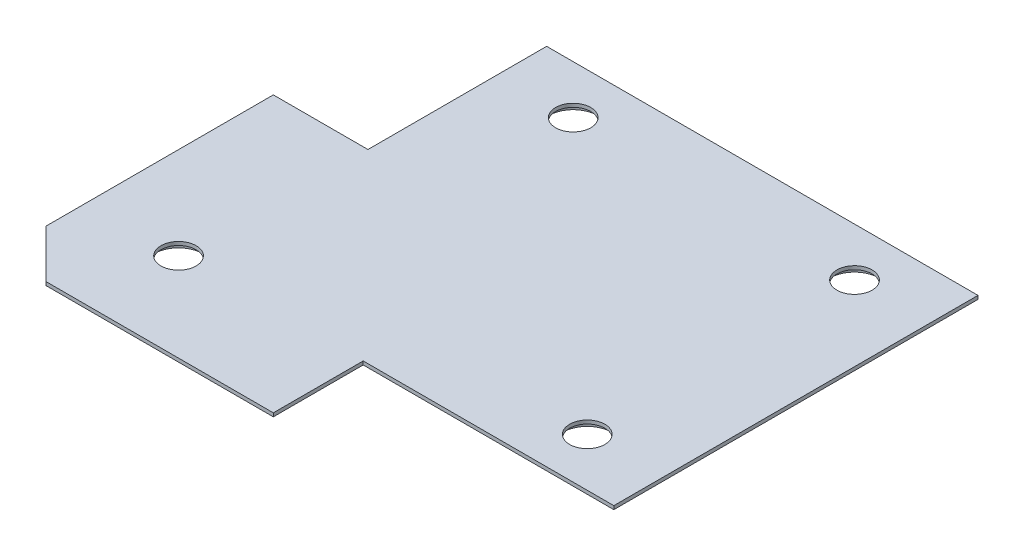
ISO-10303-21;
HEADER;
FILE_DESCRIPTION(('STEP AP214'),'2;1');
FILE_NAME('part.step','',(''),(''),'','','');
FILE_SCHEMA(('AUTOMOTIVE_DESIGN { 1 0 10303 214 1 1 1 1 }'));
ENDSEC;
DATA;
#1=APPLICATION_CONTEXT('core data for automotive mechanical design processes');
#2=APPLICATION_PROTOCOL_DEFINITION('international standard','automotive_design',2000,#1);
#3=PRODUCT_CONTEXT('',#1,'mechanical');
#4=PRODUCT('Part','Part','',(#3));
#5=PRODUCT_RELATED_PRODUCT_CATEGORY('part','',(#4));
#6=PRODUCT_DEFINITION_FORMATION('','',#4);
#7=PRODUCT_DEFINITION_CONTEXT('part definition',#1,'design');
#8=PRODUCT_DEFINITION('design','',#6,#7);
#9=PRODUCT_DEFINITION_SHAPE('','',#8);
#10=(LENGTH_UNIT() NAMED_UNIT(*) SI_UNIT(.MILLI.,.METRE.));
#11=(NAMED_UNIT(*) PLANE_ANGLE_UNIT() SI_UNIT($,.RADIAN.));
#12=(NAMED_UNIT(*) SI_UNIT($,.STERADIAN.) SOLID_ANGLE_UNIT());
#13=UNCERTAINTY_MEASURE_WITH_UNIT(LENGTH_MEASURE(1.E-05),#10,'distance_accuracy_value','');
#14=(GEOMETRIC_REPRESENTATION_CONTEXT(3) GLOBAL_UNCERTAINTY_ASSIGNED_CONTEXT((#13)) GLOBAL_UNIT_ASSIGNED_CONTEXT((#10,
#11,#12)) REPRESENTATION_CONTEXT('',''));
#15=CARTESIAN_POINT('',(0.,0.,0.));
#16=DIRECTION('',(0.,0.,1.));
#17=DIRECTION('',(1.,0.,0.));
#18=AXIS2_PLACEMENT_3D('',#15,#16,#17);
#19=CARTESIAN_POINT('',(21.1851643736294,1.5,-18.54562572709));
#20=DIRECTION('',(0.,1.,0.));
#21=DIRECTION('',(0.,0.,1.));
#22=AXIS2_PLACEMENT_3D('',#19,#20,#21);
#23=CYLINDRICAL_SURFACE('',#22,2.5);
#24=CARTESIAN_POINT('',(21.1851643736294,3.5,-18.54562572709));
#25=DIRECTION('',(0.,1.,0.));
#26=DIRECTION('',(0.,0.,1.));
#27=AXIS2_PLACEMENT_3D('',#24,#25,#26);
#28=CIRCLE('',#27,2.5);
#29=CARTESIAN_POINT('',(21.1851643736294,3.5,-16.04562572709));
#30=VERTEX_POINT('',#29);
#31=EDGE_CURVE('E159',#30,#30,#28,.T.);
#32=ORIENTED_EDGE('',*,*,#31,.T.);
#33=EDGE_LOOP('',(#32));
#34=FACE_BOUND('',#33,.T.);
#35=CARTESIAN_POINT('',(21.1851643736294,3.,-18.54562572709));
#36=DIRECTION('',(0.,-1.,0.));
#37=DIRECTION('',(0.,0.,-1.));
#38=AXIS2_PLACEMENT_3D('',#35,#36,#37);
#39=CIRCLE('',#38,2.5);
#40=CARTESIAN_POINT('',(21.1851643736294,3.,-21.04562572709));
#41=VERTEX_POINT('',#40);
#42=EDGE_CURVE('E183',#41,#41,#39,.F.);
#43=ORIENTED_EDGE('',*,*,#42,.F.);
#44=EDGE_LOOP('',(#43));
#45=FACE_BOUND('',#44,.T.);
#46=ADVANCED_FACE('F41',(#34,#45),#23,.F.);
#47=CARTESIAN_POINT('',(-18.8148356263706,1.5,-18.54562572709));
#48=DIRECTION('',(0.,1.,0.));
#49=DIRECTION('',(0.,0.,1.));
#50=AXIS2_PLACEMENT_3D('',#47,#48,#49);
#51=CYLINDRICAL_SURFACE('',#50,2.5);
#52=CARTESIAN_POINT('',(-18.8148356263706,3.5,-18.54562572709));
#53=DIRECTION('',(0.,1.,0.));
#54=DIRECTION('',(0.,0.,1.));
#55=AXIS2_PLACEMENT_3D('',#52,#53,#54);
#56=CIRCLE('',#55,2.5);
#57=CARTESIAN_POINT('',(-18.8148356263706,3.5,-16.04562572709));
#58=VERTEX_POINT('',#57);
#59=EDGE_CURVE('E266',#58,#58,#56,.T.);
#60=ORIENTED_EDGE('',*,*,#59,.T.);
#61=EDGE_LOOP('',(#60));
#62=FACE_BOUND('',#61,.T.);
#63=CARTESIAN_POINT('',(-18.8148356263706,3.,-18.54562572709));
#64=DIRECTION('',(0.,-1.,0.));
#65=DIRECTION('',(0.,0.,-1.));
#66=AXIS2_PLACEMENT_3D('',#63,#64,#65);
#67=CIRCLE('',#66,2.5);
#68=CARTESIAN_POINT('',(-18.8148356263706,3.,-21.04562572709));
#69=VERTEX_POINT('',#68);
#70=EDGE_CURVE('E180',#69,#69,#67,.F.);
#71=ORIENTED_EDGE('',*,*,#70,.F.);
#72=EDGE_LOOP('',(#71));
#73=FACE_BOUND('',#72,.T.);
#74=ADVANCED_FACE('F366',(#62,#73),#51,.F.);
#75=CARTESIAN_POINT('',(21.1851643736294,1.5,19.45437427291));
#76=DIRECTION('',(0.,1.,0.));
#77=DIRECTION('',(0.,0.,1.));
#78=AXIS2_PLACEMENT_3D('',#75,#76,#77);
#79=CYLINDRICAL_SURFACE('',#78,2.5);
#80=CARTESIAN_POINT('',(21.1851643736294,3.5,19.45437427291));
#81=DIRECTION('',(0.,1.,0.));
#82=DIRECTION('',(0.,0.,1.));
#83=AXIS2_PLACEMENT_3D('',#80,#81,#82);
#84=CIRCLE('',#83,2.5);
#85=CARTESIAN_POINT('',(21.1851643736294,3.5,21.95437427291));
#86=VERTEX_POINT('',#85);
#87=EDGE_CURVE('E269',#86,#86,#84,.T.);
#88=ORIENTED_EDGE('',*,*,#87,.T.);
#89=EDGE_LOOP('',(#88));
#90=FACE_BOUND('',#89,.T.);
#91=CARTESIAN_POINT('',(21.1851643736294,3.,19.45437427291));
#92=DIRECTION('',(0.,-1.,0.));
#93=DIRECTION('',(0.,0.,-1.));
#94=AXIS2_PLACEMENT_3D('',#91,#92,#93);
#95=CIRCLE('',#94,2.5);
#96=CARTESIAN_POINT('',(21.1851643736294,3.,16.95437427291));
#97=VERTEX_POINT('',#96);
#98=EDGE_CURVE('E176',#97,#97,#95,.F.);
#99=ORIENTED_EDGE('',*,*,#98,.F.);
#100=EDGE_LOOP('',(#99));
#101=FACE_BOUND('',#100,.T.);
#102=ADVANCED_FACE('F372',(#90,#101),#79,.F.);
#103=CARTESIAN_POINT('',(-29.8548356263706,1.5,26.5291378794875));
#104=DIRECTION('',(0.,1.,0.));
#105=DIRECTION('',(0.,0.,1.));
#106=AXIS2_PLACEMENT_3D('',#103,#104,#105);
#107=CYLINDRICAL_SURFACE('',#106,2.5);
#108=CARTESIAN_POINT('',(-29.8548356263706,3.5,26.5291378794875));
#109=DIRECTION('',(0.,1.,0.));
#110=DIRECTION('',(0.,0.,1.));
#111=AXIS2_PLACEMENT_3D('',#108,#109,#110);
#112=CIRCLE('',#111,2.5);
#113=CARTESIAN_POINT('',(-29.8548356263706,3.5,29.0291378794875));
#114=VERTEX_POINT('',#113);
#115=EDGE_CURVE('E185',#114,#114,#112,.T.);
#116=ORIENTED_EDGE('',*,*,#115,.T.);
#117=EDGE_LOOP('',(#116));
#118=FACE_BOUND('',#117,.T.);
#119=CARTESIAN_POINT('',(-29.8548356263706,3.,26.5291378794875));
#120=DIRECTION('',(0.,-1.,0.));
#121=DIRECTION('',(0.,0.,-1.));
#122=AXIS2_PLACEMENT_3D('',#119,#120,#121);
#123=CIRCLE('',#122,2.5);
#124=CARTESIAN_POINT('',(-29.8548356263706,3.,24.0291378794875));
#125=VERTEX_POINT('',#124);
#126=EDGE_CURVE('E173',#125,#125,#123,.F.);
#127=ORIENTED_EDGE('',*,*,#126,.F.);
#128=EDGE_LOOP('',(#127));
#129=FACE_BOUND('',#128,.T.);
#130=ADVANCED_FACE('F378',(#118,#129),#107,.F.);
#131=CARTESIAN_POINT('',(-29.4806035931873,3.5,-0.0264334137700193));
#132=DIRECTION('',(1.,0.,0.));
#133=DIRECTION('',(0.,0.,-1.));
#134=AXIS2_PLACEMENT_3D('',#131,#132,#133);
#135=PLANE('',#134);
#136=DIRECTION('',(0.,-1.,0.));
#137=VECTOR('',#136,1.);
#138=CARTESIAN_POINT('',(-29.4806035931873,3.5,-25.4359182046136));
#139=LINE('',#138,#137);
#140=CARTESIAN_POINT('',(-29.4806035931873,3.5,-25.4359182046136));
#141=VERTEX_POINT('',#140);
#142=CARTESIAN_POINT('',(-29.4806035931873,3.00000000000001,-25.4359182046136));
#143=VERTEX_POINT('',#142);
#144=EDGE_CURVE('E288',#141,#143,#139,.T.);
#145=ORIENTED_EDGE('',*,*,#144,.T.);
#146=DIRECTION('',(0.,0.,1.));
#147=VECTOR('',#146,1.);
#148=CARTESIAN_POINT('',(-29.4806035931873,3.00000000000001,-0.0264334137700193));
#149=LINE('',#148,#147);
#150=CARTESIAN_POINT('',(-29.4806035931873,3.00000000000001,-0.0264334137700193));
#151=VERTEX_POINT('',#150);
#152=EDGE_CURVE('E163',#143,#151,#149,.T.);
#153=ORIENTED_EDGE('',*,*,#152,.T.);
#154=DIRECTION('',(0.,-1.,0.));
#155=VECTOR('',#154,1.);
#156=CARTESIAN_POINT('',(-29.4806035931873,3.5,-0.0264334137700193));
#157=LINE('',#156,#155);
#158=CARTESIAN_POINT('',(-29.4806035931873,3.5,-0.0264334137700193));
#159=VERTEX_POINT('',#158);
#160=EDGE_CURVE('E144',#159,#151,#157,.T.);
#161=ORIENTED_EDGE('',*,*,#160,.F.);
#162=DIRECTION('',(0.,0.,1.));
#163=VECTOR('',#162,1.);
#164=CARTESIAN_POINT('',(-29.4806035931873,3.5,-0.0264334137700193));
#165=LINE('',#164,#163);
#166=EDGE_CURVE('E150',#141,#159,#165,.T.);
#167=ORIENTED_EDGE('',*,*,#166,.F.);
#168=EDGE_LOOP('',(#145,#153,#161,#167));
#169=FACE_BOUND('',#168,.T.);
#170=ADVANCED_FACE('F161',(#169),#135,.F.);
#171=CARTESIAN_POINT('',(-42.9335057092703,3.5,-0.0264334137700193));
#172=DIRECTION('',(0.,0.,1.));
#173=DIRECTION('',(1.,0.,0.));
#174=AXIS2_PLACEMENT_3D('',#171,#172,#173);
#175=PLANE('',#174);
#176=ORIENTED_EDGE('',*,*,#160,.T.);
#177=DIRECTION('',(-1.,0.,0.));
#178=VECTOR('',#177,1.);
#179=CARTESIAN_POINT('',(-42.9335057092703,3.00000000000001,-0.0264334137700193));
#180=LINE('',#179,#178);
#181=CARTESIAN_POINT('',(-42.9335057092703,3.00000000000001,-0.0264334137700193));
#182=VERTEX_POINT('',#181);
#183=EDGE_CURVE('E65',#151,#182,#180,.T.);
#184=ORIENTED_EDGE('',*,*,#183,.T.);
#185=DIRECTION('',(0.,-1.,0.));
#186=VECTOR('',#185,1.);
#187=CARTESIAN_POINT('',(-42.9335057092703,3.5,-0.0264334137700193));
#188=LINE('',#187,#186);
#189=CARTESIAN_POINT('',(-42.9335057092703,3.5,-0.0264334137700193));
#190=VERTEX_POINT('',#189);
#191=EDGE_CURVE('E146',#190,#182,#188,.T.);
#192=ORIENTED_EDGE('',*,*,#191,.F.);
#193=DIRECTION('',(-1.,0.,0.));
#194=VECTOR('',#193,1.);
#195=CARTESIAN_POINT('',(-42.9335057092703,3.5,-0.0264334137700193));
#196=LINE('',#195,#194);
#197=EDGE_CURVE('E140',#159,#190,#196,.T.);
#198=ORIENTED_EDGE('',*,*,#197,.F.);
#199=EDGE_LOOP('',(#176,#184,#192,#198));
#200=FACE_BOUND('',#199,.T.);
#201=ADVANCED_FACE('F142',(#200),#175,.F.);
#202=CARTESIAN_POINT('',(-42.9335057092703,3.5,32.2961580116147));
#203=DIRECTION('',(1.,0.,0.));
#204=DIRECTION('',(0.,0.,-1.));
#205=AXIS2_PLACEMENT_3D('',#202,#203,#204);
#206=PLANE('',#205);
#207=ORIENTED_EDGE('',*,*,#191,.T.);
#208=DIRECTION('',(0.,0.,1.));
#209=VECTOR('',#208,1.);
#210=CARTESIAN_POINT('',(-42.9335057092703,3.00000000000001,32.2961580116147));
#211=LINE('',#210,#209);
#212=CARTESIAN_POINT('',(-42.9335057092703,3.00000000000001,32.2961580116147));
#213=VERTEX_POINT('',#212);
#214=EDGE_CURVE('E11',#182,#213,#211,.T.);
#215=ORIENTED_EDGE('',*,*,#214,.T.);
#216=DIRECTION('',(0.,-1.,0.));
#217=VECTOR('',#216,1.);
#218=CARTESIAN_POINT('',(-42.9335057092703,3.5,32.2961580116147));
#219=LINE('',#218,#217);
#220=CARTESIAN_POINT('',(-42.9335057092703,3.5,32.2961580116147));
#221=VERTEX_POINT('',#220);
#222=EDGE_CURVE('E169',#221,#213,#219,.T.);
#223=ORIENTED_EDGE('',*,*,#222,.F.);
#224=DIRECTION('',(0.,0.,1.));
#225=VECTOR('',#224,1.);
#226=CARTESIAN_POINT('',(-42.9335057092703,3.5,32.2961580116147));
#227=LINE('',#226,#225);
#228=EDGE_CURVE('E149',#190,#221,#227,.T.);
#229=ORIENTED_EDGE('',*,*,#228,.F.);
#230=EDGE_LOOP('',(#207,#215,#223,#229));
#231=FACE_BOUND('',#230,.T.);
#232=ADVANCED_FACE('F333',(#231),#206,.F.);
#233=CARTESIAN_POINT('',(-36.1050785845241,3.5,39.1245851363609));
#234=DIRECTION('',(0.707106781186547,0.,-0.707106781186548));
#235=DIRECTION('',(-0.707106781186548,0.,-0.707106781186547));
#236=AXIS2_PLACEMENT_3D('',#233,#234,#235);
#237=PLANE('',#236);
#238=ORIENTED_EDGE('',*,*,#222,.T.);
#239=DIRECTION('',(0.707106781186548,0.,0.707106781186547));
#240=VECTOR('',#239,1.);
#241=CARTESIAN_POINT('',(-36.1050785845241,3.00000000000001,39.1245851363609));
#242=LINE('',#241,#240);
#243=CARTESIAN_POINT('',(-36.1050785845241,3.00000000000001,39.1245851363609));
#244=VERTEX_POINT('',#243);
#245=EDGE_CURVE('E51',#213,#244,#242,.T.);
#246=ORIENTED_EDGE('',*,*,#245,.T.);
#247=DIRECTION('',(0.,-1.,0.));
#248=VECTOR('',#247,1.);
#249=CARTESIAN_POINT('',(-36.1050785845241,3.5,39.1245851363609));
#250=LINE('',#249,#248);
#251=CARTESIAN_POINT('',(-36.1050785845241,3.5,39.1245851363609));
#252=VERTEX_POINT('',#251);
#253=EDGE_CURVE('E302',#252,#244,#250,.T.);
#254=ORIENTED_EDGE('',*,*,#253,.F.);
#255=DIRECTION('',(0.707106781186548,0.,0.707106781186547));
#256=VECTOR('',#255,1.);
#257=CARTESIAN_POINT('',(-36.1050785845241,3.5,39.1245851363609));
#258=LINE('',#257,#256);
#259=EDGE_CURVE('E277',#221,#252,#258,.T.);
#260=ORIENTED_EDGE('',*,*,#259,.F.);
#261=EDGE_LOOP('',(#238,#246,#254,#260));
#262=FACE_BOUND('',#261,.T.);
#263=ADVANCED_FACE('F307',(#262),#237,.F.);
#264=CARTESIAN_POINT('',(-3.78248715913939,3.5,39.1245851363609));
#265=DIRECTION('',(0.,0.,-1.));
#266=DIRECTION('',(-1.,0.,0.));
#267=AXIS2_PLACEMENT_3D('',#264,#265,#266);
#268=PLANE('',#267);
#269=ORIENTED_EDGE('',*,*,#253,.T.);
#270=DIRECTION('',(1.,0.,0.));
#271=VECTOR('',#270,1.);
#272=CARTESIAN_POINT('',(-3.78248715913939,3.00000000000001,39.1245851363609));
#273=LINE('',#272,#271);
#274=CARTESIAN_POINT('',(-3.78248715913939,3.00000000000001,39.1245851363609));
#275=VERTEX_POINT('',#274);
#276=EDGE_CURVE('E164',#244,#275,#273,.T.);
#277=ORIENTED_EDGE('',*,*,#276,.T.);
#278=DIRECTION('',(0.,-1.,0.));
#279=VECTOR('',#278,1.);
#280=CARTESIAN_POINT('',(-3.78248715913939,3.5,39.1245851363609));
#281=LINE('',#280,#279);
#282=CARTESIAN_POINT('',(-3.78248715913939,3.5,39.1245851363609));
#283=VERTEX_POINT('',#282);
#284=EDGE_CURVE('E299',#283,#275,#281,.T.);
#285=ORIENTED_EDGE('',*,*,#284,.F.);
#286=DIRECTION('',(1.,0.,0.));
#287=VECTOR('',#286,1.);
#288=CARTESIAN_POINT('',(-3.78248715913939,3.5,39.1245851363609));
#289=LINE('',#288,#287);
#290=EDGE_CURVE('E279',#252,#283,#289,.T.);
#291=ORIENTED_EDGE('',*,*,#290,.F.);
#292=EDGE_LOOP('',(#269,#277,#285,#291));
#293=FACE_BOUND('',#292,.T.);
#294=ADVANCED_FACE('F325',(#293),#268,.F.);
#295=CARTESIAN_POINT('',(-3.78248715913939,3.5,26.3446667504336));
#296=DIRECTION('',(-1.,0.,0.));
#297=DIRECTION('',(0.,0.,1.));
#298=AXIS2_PLACEMENT_3D('',#295,#296,#297);
#299=PLANE('',#298);
#300=ORIENTED_EDGE('',*,*,#284,.T.);
#301=DIRECTION('',(0.,0.,-1.));
#302=VECTOR('',#301,1.);
#303=CARTESIAN_POINT('',(-3.78248715913939,3.00000000000001,26.3446667504336));
#304=LINE('',#303,#302);
#305=CARTESIAN_POINT('',(-3.78248715913939,3.00000000000001,26.3446667504336));
#306=VERTEX_POINT('',#305);
#307=EDGE_CURVE('E205',#275,#306,#304,.T.);
#308=ORIENTED_EDGE('',*,*,#307,.T.);
#309=DIRECTION('',(0.,-1.,0.));
#310=VECTOR('',#309,1.);
#311=CARTESIAN_POINT('',(-3.78248715913939,3.5,26.3446667504336));
#312=LINE('',#311,#310);
#313=CARTESIAN_POINT('',(-3.78248715913939,3.5,26.3446667504336));
#314=VERTEX_POINT('',#313);
#315=EDGE_CURVE('E296',#314,#306,#312,.T.);
#316=ORIENTED_EDGE('',*,*,#315,.F.);
#317=DIRECTION('',(0.,0.,-1.));
#318=VECTOR('',#317,1.);
#319=CARTESIAN_POINT('',(-3.78248715913939,3.5,26.3446667504336));
#320=LINE('',#319,#318);
#321=EDGE_CURVE('E281',#283,#314,#320,.T.);
#322=ORIENTED_EDGE('',*,*,#321,.F.);
#323=EDGE_LOOP('',(#300,#308,#316,#322));
#324=FACE_BOUND('',#323,.T.);
#325=ADVANCED_FACE('F329',(#324),#299,.F.);
#326=CARTESIAN_POINT('',(31.8509323404461,3.5,26.3446667504336));
#327=DIRECTION('',(0.,0.,-1.));
#328=DIRECTION('',(-1.,0.,0.));
#329=AXIS2_PLACEMENT_3D('',#326,#327,#328);
#330=PLANE('',#329);
#331=ORIENTED_EDGE('',*,*,#315,.T.);
#332=DIRECTION('',(1.,0.,0.));
#333=VECTOR('',#332,1.);
#334=CARTESIAN_POINT('',(31.8509323404461,3.00000000000001,26.3446667504336));
#335=LINE('',#334,#333);
#336=CARTESIAN_POINT('',(31.8509323404461,3.00000000000001,26.3446667504336));
#337=VERTEX_POINT('',#336);
#338=EDGE_CURVE('E207',#306,#337,#335,.T.);
#339=ORIENTED_EDGE('',*,*,#338,.T.);
#340=DIRECTION('',(0.,-1.,0.));
#341=VECTOR('',#340,1.);
#342=CARTESIAN_POINT('',(31.8509323404461,3.5,26.3446667504336));
#343=LINE('',#342,#341);
#344=CARTESIAN_POINT('',(31.8509323404461,3.5,26.3446667504336));
#345=VERTEX_POINT('',#344);
#346=EDGE_CURVE('E293',#345,#337,#343,.T.);
#347=ORIENTED_EDGE('',*,*,#346,.F.);
#348=DIRECTION('',(1.,0.,0.));
#349=VECTOR('',#348,1.);
#350=CARTESIAN_POINT('',(31.8509323404461,3.5,26.3446667504336));
#351=LINE('',#350,#349);
#352=EDGE_CURVE('E283',#314,#345,#351,.T.);
#353=ORIENTED_EDGE('',*,*,#352,.F.);
#354=EDGE_LOOP('',(#331,#339,#347,#353));
#355=FACE_BOUND('',#354,.T.);
#356=ADVANCED_FACE('F393',(#355),#330,.F.);
#357=CARTESIAN_POINT('',(31.8509323404461,3.5,-25.4359182046136));
#358=DIRECTION('',(-1.,0.,0.));
#359=DIRECTION('',(0.,0.,1.));
#360=AXIS2_PLACEMENT_3D('',#357,#358,#359);
#361=PLANE('',#360);
#362=ORIENTED_EDGE('',*,*,#346,.T.);
#363=DIRECTION('',(0.,0.,-1.));
#364=VECTOR('',#363,1.);
#365=CARTESIAN_POINT('',(31.8509323404461,3.00000000000001,-25.4359182046136));
#366=LINE('',#365,#364);
#367=CARTESIAN_POINT('',(31.8509323404461,3.00000000000001,-25.4359182046136));
#368=VERTEX_POINT('',#367);
#369=EDGE_CURVE('E209',#337,#368,#366,.T.);
#370=ORIENTED_EDGE('',*,*,#369,.T.);
#371=DIRECTION('',(0.,-1.,0.));
#372=VECTOR('',#371,1.);
#373=CARTESIAN_POINT('',(31.8509323404461,3.5,-25.4359182046136));
#374=LINE('',#373,#372);
#375=CARTESIAN_POINT('',(31.8509323404461,3.5,-25.4359182046136));
#376=VERTEX_POINT('',#375);
#377=EDGE_CURVE('E290',#376,#368,#374,.T.);
#378=ORIENTED_EDGE('',*,*,#377,.F.);
#379=DIRECTION('',(0.,0.,-1.));
#380=VECTOR('',#379,1.);
#381=CARTESIAN_POINT('',(31.8509323404461,3.5,-25.4359182046136));
#382=LINE('',#381,#380);
#383=EDGE_CURVE('E285',#345,#376,#382,.T.);
#384=ORIENTED_EDGE('',*,*,#383,.F.);
#385=EDGE_LOOP('',(#362,#370,#378,#384));
#386=FACE_BOUND('',#385,.T.);
#387=ADVANCED_FACE('F389',(#386),#361,.F.);
#388=CARTESIAN_POINT('',(-29.4806035931873,3.5,-25.4359182046136));
#389=DIRECTION('',(0.,0.,1.));
#390=DIRECTION('',(1.,0.,0.));
#391=AXIS2_PLACEMENT_3D('',#388,#389,#390);
#392=PLANE('',#391);
#393=ORIENTED_EDGE('',*,*,#377,.T.);
#394=DIRECTION('',(-1.,0.,0.));
#395=VECTOR('',#394,1.);
#396=CARTESIAN_POINT('',(-29.4806035931873,3.00000000000001,-25.4359182046136));
#397=LINE('',#396,#395);
#398=EDGE_CURVE('E211',#368,#143,#397,.T.);
#399=ORIENTED_EDGE('',*,*,#398,.T.);
#400=ORIENTED_EDGE('',*,*,#144,.F.);
#401=DIRECTION('',(-1.,0.,0.));
#402=VECTOR('',#401,1.);
#403=CARTESIAN_POINT('',(-29.4806035931873,3.5,-25.4359182046136));
#404=LINE('',#403,#402);
#405=EDGE_CURVE('E155',#376,#141,#404,.T.);
#406=ORIENTED_EDGE('',*,*,#405,.F.);
#407=EDGE_LOOP('',(#393,#399,#400,#406));
#408=FACE_BOUND('',#407,.T.);
#409=ADVANCED_FACE('F385',(#408),#392,.F.);
#410=CARTESIAN_POINT('',(0.,3.5,0.));
#411=DIRECTION('',(0.,-1.,0.));
#412=DIRECTION('',(0.,0.,-1.));
#413=AXIS2_PLACEMENT_3D('',#410,#411,#412);
#414=PLANE('',#413);
#415=ORIENTED_EDGE('',*,*,#115,.F.);
#416=EDGE_LOOP('',(#415));
#417=FACE_BOUND('',#416,.T.);
#418=ORIENTED_EDGE('',*,*,#87,.F.);
#419=EDGE_LOOP('',(#418));
#420=FACE_BOUND('',#419,.T.);
#421=ORIENTED_EDGE('',*,*,#59,.F.);
#422=EDGE_LOOP('',(#421));
#423=FACE_BOUND('',#422,.T.);
#424=ORIENTED_EDGE('',*,*,#31,.F.);
#425=EDGE_LOOP('',(#424));
#426=FACE_BOUND('',#425,.T.);
#427=ORIENTED_EDGE('',*,*,#166,.T.);
#428=ORIENTED_EDGE('',*,*,#197,.T.);
#429=ORIENTED_EDGE('',*,*,#228,.T.);
#430=ORIENTED_EDGE('',*,*,#259,.T.);
#431=ORIENTED_EDGE('',*,*,#290,.T.);
#432=ORIENTED_EDGE('',*,*,#321,.T.);
#433=ORIENTED_EDGE('',*,*,#352,.T.);
#434=ORIENTED_EDGE('',*,*,#383,.T.);
#435=ORIENTED_EDGE('',*,*,#405,.T.);
#436=EDGE_LOOP('',(#427,#428,#429,#430,#431,#432,#433,#434,#435));
#437=FACE_BOUND('',#436,.T.);
#438=ADVANCED_FACE('F153',(#417,#420,#423,#426,#437),#414,.F.);
#439=CARTESIAN_POINT('',(0.,2.,0.));
#440=DIRECTION('',(0.,-1.,0.));
#441=DIRECTION('',(0.,0.,-1.));
#442=AXIS2_PLACEMENT_3D('',#439,#440,#441);
#443=PLANE('',#442);
#444=DIRECTION('',(0.,0.,1.));
#445=VECTOR('',#444,1.);
#446=CARTESIAN_POINT('',(-4.7824871591394,2.,39.1245851363609));
#447=LINE('',#446,#445);
#448=CARTESIAN_POINT('',(-4.78248715913941,2.,25.3446667504336));
#449=VERTEX_POINT('',#448);
#450=CARTESIAN_POINT('',(-4.7824871591394,2.,38.1245851363609));
#451=VERTEX_POINT('',#450);
#452=EDGE_CURVE('E200',#449,#451,#447,.T.);
#453=ORIENTED_EDGE('',*,*,#452,.T.);
#454=DIRECTION('',(-1.,0.,0.));
#455=VECTOR('',#454,1.);
#456=CARTESIAN_POINT('',(-36.1050785845241,2.,38.1245851363609));
#457=LINE('',#456,#455);
#458=CARTESIAN_POINT('',(-35.690865022151,2.,38.1245851363609));
#459=VERTEX_POINT('',#458);
#460=EDGE_CURVE('E202',#451,#459,#457,.T.);
#461=ORIENTED_EDGE('',*,*,#460,.T.);
#462=DIRECTION('',(-0.707106781186548,0.,-0.707106781186547));
#463=VECTOR('',#462,1.);
#464=CARTESIAN_POINT('',(-42.2263989280837,2.,31.5890512304281));
#465=LINE('',#464,#463);
#466=CARTESIAN_POINT('',(-41.9335057092703,2.,31.8819444492416));
#467=VERTEX_POINT('',#466);
#468=EDGE_CURVE('E188',#459,#467,#465,.T.);
#469=ORIENTED_EDGE('',*,*,#468,.T.);
#470=DIRECTION('',(0.,0.,-1.));
#471=VECTOR('',#470,1.);
#472=CARTESIAN_POINT('',(-41.9335057092703,2.,-0.0264334137700176));
#473=LINE('',#472,#471);
#474=CARTESIAN_POINT('',(-41.9335057092703,2.,0.973566586229995));
#475=VERTEX_POINT('',#474);
#476=EDGE_CURVE('E167',#467,#475,#473,.T.);
#477=ORIENTED_EDGE('',*,*,#476,.T.);
#478=DIRECTION('',(1.,0.,0.));
#479=VECTOR('',#478,1.);
#480=CARTESIAN_POINT('',(-29.4806035931873,2.,0.973566586229995));
#481=LINE('',#480,#479);
#482=CARTESIAN_POINT('',(-28.4806035931873,2.,0.973566586229995));
#483=VERTEX_POINT('',#482);
#484=EDGE_CURVE('E190',#475,#483,#481,.T.);
#485=ORIENTED_EDGE('',*,*,#484,.T.);
#486=DIRECTION('',(0.,0.,-1.));
#487=VECTOR('',#486,1.);
#488=CARTESIAN_POINT('',(-28.4806035931873,2.,-25.4359182046136));
#489=LINE('',#488,#487);
#490=CARTESIAN_POINT('',(-28.4806035931873,2.,-24.4359182046136));
#491=VERTEX_POINT('',#490);
#492=EDGE_CURVE('E192',#483,#491,#489,.T.);
#493=ORIENTED_EDGE('',*,*,#492,.T.);
#494=DIRECTION('',(1.,0.,0.));
#495=VECTOR('',#494,1.);
#496=CARTESIAN_POINT('',(31.8509323404461,2.,-24.4359182046136));
#497=LINE('',#496,#495);
#498=CARTESIAN_POINT('',(30.8509323404461,2.,-24.4359182046136));
#499=VERTEX_POINT('',#498);
#500=EDGE_CURVE('E194',#491,#499,#497,.T.);
#501=ORIENTED_EDGE('',*,*,#500,.T.);
#502=DIRECTION('',(0.,0.,1.));
#503=VECTOR('',#502,1.);
#504=CARTESIAN_POINT('',(30.8509323404461,2.,26.3446667504336));
#505=LINE('',#504,#503);
#506=CARTESIAN_POINT('',(30.8509323404461,2.,25.3446667504336));
#507=VERTEX_POINT('',#506);
#508=EDGE_CURVE('E196',#499,#507,#505,.T.);
#509=ORIENTED_EDGE('',*,*,#508,.T.);
#510=DIRECTION('',(-1.,0.,0.));
#511=VECTOR('',#510,1.);
#512=CARTESIAN_POINT('',(-3.78248715913939,2.,25.3446667504336));
#513=LINE('',#512,#511);
#514=EDGE_CURVE('E198',#507,#449,#513,.T.);
#515=ORIENTED_EDGE('',*,*,#514,.T.);
#516=EDGE_LOOP('',(#453,#461,#469,#477,#485,#493,#501,#509,#515));
#517=FACE_BOUND('',#516,.T.);
#518=CARTESIAN_POINT('',(-29.8548356263706,2.,26.5291378794875));
#519=DIRECTION('',(0.,-1.,0.));
#520=DIRECTION('',(0.,0.,-1.));
#521=AXIS2_PLACEMENT_3D('',#518,#519,#520);
#522=CIRCLE('',#521,3.5);
#523=CARTESIAN_POINT('',(-29.8548356263706,2.,23.0291378794875));
#524=VERTEX_POINT('',#523);
#525=EDGE_CURVE('E257',#524,#524,#522,.T.);
#526=ORIENTED_EDGE('',*,*,#525,.F.);
#527=EDGE_LOOP('',(#526));
#528=FACE_BOUND('',#527,.T.);
#529=CARTESIAN_POINT('',(21.1851643736294,2.,-18.54562572709));
#530=DIRECTION('',(0.,-1.,0.));
#531=DIRECTION('',(0.,0.,-1.));
#532=AXIS2_PLACEMENT_3D('',#529,#530,#531);
#533=CIRCLE('',#532,3.5);
#534=CARTESIAN_POINT('',(21.1851643736294,2.,-22.04562572709));
#535=VERTEX_POINT('',#534);
#536=EDGE_CURVE('E245',#535,#535,#533,.T.);
#537=ORIENTED_EDGE('',*,*,#536,.F.);
#538=EDGE_LOOP('',(#537));
#539=FACE_BOUND('',#538,.T.);
#540=CARTESIAN_POINT('',(-18.8148356263706,2.,-18.54562572709));
#541=DIRECTION('',(0.,-1.,0.));
#542=DIRECTION('',(0.,0.,-1.));
#543=AXIS2_PLACEMENT_3D('',#540,#541,#542);
#544=CIRCLE('',#543,3.5);
#545=CARTESIAN_POINT('',(-18.8148356263706,2.,-22.04562572709));
#546=VERTEX_POINT('',#545);
#547=EDGE_CURVE('E261',#546,#546,#544,.T.);
#548=ORIENTED_EDGE('',*,*,#547,.F.);
#549=EDGE_LOOP('',(#548));
#550=FACE_BOUND('',#549,.T.);
#551=CARTESIAN_POINT('',(21.1851643736294,2.,19.45437427291));
#552=DIRECTION('',(0.,-1.,0.));
#553=DIRECTION('',(0.,0.,-1.));
#554=AXIS2_PLACEMENT_3D('',#551,#552,#553);
#555=CIRCLE('',#554,3.5);
#556=CARTESIAN_POINT('',(21.1851643736294,2.,15.95437427291));
#557=VERTEX_POINT('',#556);
#558=EDGE_CURVE('E254',#557,#557,#555,.T.);
#559=ORIENTED_EDGE('',*,*,#558,.F.);
#560=EDGE_LOOP('',(#559));
#561=FACE_BOUND('',#560,.T.);
#562=ADVANCED_FACE('F338',(#517,#528,#539,#550,#561),#443,.T.);
#563=CARTESIAN_POINT('',(-29.8548356263706,3.,26.5291378794875));
#564=DIRECTION('',(0.,-1.,0.));
#565=DIRECTION('',(0.,0.,-1.));
#566=AXIS2_PLACEMENT_3D('',#563,#564,#565);
#567=PLANE('',#566);
#568=CARTESIAN_POINT('',(-29.8548356263706,3.,26.5291378794875));
#569=DIRECTION('',(0.,-1.,0.));
#570=DIRECTION('',(0.,0.,-1.));
#571=AXIS2_PLACEMENT_3D('',#568,#569,#570);
#572=CIRCLE('',#571,3.5);
#573=CARTESIAN_POINT('',(-29.8548356263706,3.,23.0291378794875));
#574=VERTEX_POINT('',#573);
#575=EDGE_CURVE('E177',#574,#574,#572,.T.);
#576=ORIENTED_EDGE('',*,*,#575,.T.);
#577=EDGE_LOOP('',(#576));
#578=FACE_BOUND('',#577,.T.);
#579=ORIENTED_EDGE('',*,*,#126,.T.);
#580=EDGE_LOOP('',(#579));
#581=FACE_BOUND('',#580,.T.);
#582=ADVANCED_FACE('F382',(#578,#581),#567,.T.);
#583=CARTESIAN_POINT('',(-29.8548356263706,3.,26.5291378794875));
#584=DIRECTION('',(0.,-1.,0.));
#585=DIRECTION('',(0.,0.,-1.));
#586=AXIS2_PLACEMENT_3D('',#583,#584,#585);
#587=CYLINDRICAL_SURFACE('',#586,3.5);
#588=ORIENTED_EDGE('',*,*,#575,.F.);
#589=EDGE_LOOP('',(#588));
#590=FACE_BOUND('',#589,.T.);
#591=ORIENTED_EDGE('',*,*,#525,.T.);
#592=EDGE_LOOP('',(#591));
#593=FACE_BOUND('',#592,.T.);
#594=ADVANCED_FACE('F457',(#590,#593),#587,.F.);
#595=CARTESIAN_POINT('',(21.1851643736294,3.,19.45437427291));
#596=DIRECTION('',(0.,-1.,0.));
#597=DIRECTION('',(0.,0.,-1.));
#598=AXIS2_PLACEMENT_3D('',#595,#596,#597);
#599=PLANE('',#598);
#600=CARTESIAN_POINT('',(21.1851643736294,3.,19.45437427291));
#601=DIRECTION('',(0.,-1.,0.));
#602=DIRECTION('',(0.,0.,-1.));
#603=AXIS2_PLACEMENT_3D('',#600,#601,#602);
#604=CIRCLE('',#603,3.5);
#605=CARTESIAN_POINT('',(21.1851643736294,3.,15.95437427291));
#606=VERTEX_POINT('',#605);
#607=EDGE_CURVE('E258',#606,#606,#604,.T.);
#608=ORIENTED_EDGE('',*,*,#607,.T.);
#609=EDGE_LOOP('',(#608));
#610=FACE_BOUND('',#609,.T.);
#611=ORIENTED_EDGE('',*,*,#98,.T.);
#612=EDGE_LOOP('',(#611));
#613=FACE_BOUND('',#612,.T.);
#614=ADVANCED_FACE('F464',(#610,#613),#599,.T.);
#615=CARTESIAN_POINT('',(21.1851643736294,3.,19.45437427291));
#616=DIRECTION('',(0.,-1.,0.));
#617=DIRECTION('',(0.,0.,-1.));
#618=AXIS2_PLACEMENT_3D('',#615,#616,#617);
#619=CYLINDRICAL_SURFACE('',#618,3.5);
#620=ORIENTED_EDGE('',*,*,#607,.F.);
#621=EDGE_LOOP('',(#620));
#622=FACE_BOUND('',#621,.T.);
#623=ORIENTED_EDGE('',*,*,#558,.T.);
#624=EDGE_LOOP('',(#623));
#625=FACE_BOUND('',#624,.T.);
#626=ADVANCED_FACE('F460',(#622,#625),#619,.F.);
#627=CARTESIAN_POINT('',(-18.8148356263706,3.,-18.54562572709));
#628=DIRECTION('',(0.,-1.,0.));
#629=DIRECTION('',(0.,0.,-1.));
#630=AXIS2_PLACEMENT_3D('',#627,#628,#629);
#631=PLANE('',#630);
#632=CARTESIAN_POINT('',(-18.8148356263706,3.,-18.54562572709));
#633=DIRECTION('',(0.,-1.,0.));
#634=DIRECTION('',(0.,0.,-1.));
#635=AXIS2_PLACEMENT_3D('',#632,#633,#634);
#636=CIRCLE('',#635,3.5);
#637=CARTESIAN_POINT('',(-18.8148356263706,3.,-22.04562572709));
#638=VERTEX_POINT('',#637);
#639=EDGE_CURVE('E250',#638,#638,#636,.T.);
#640=ORIENTED_EDGE('',*,*,#639,.T.);
#641=EDGE_LOOP('',(#640));
#642=FACE_BOUND('',#641,.T.);
#643=ORIENTED_EDGE('',*,*,#70,.T.);
#644=EDGE_LOOP('',(#643));
#645=FACE_BOUND('',#644,.T.);
#646=ADVANCED_FACE('F463',(#642,#645),#631,.T.);
#647=CARTESIAN_POINT('',(-18.8148356263706,3.,-18.54562572709));
#648=DIRECTION('',(0.,-1.,0.));
#649=DIRECTION('',(0.,0.,-1.));
#650=AXIS2_PLACEMENT_3D('',#647,#648,#649);
#651=CYLINDRICAL_SURFACE('',#650,3.5);
#652=ORIENTED_EDGE('',*,*,#639,.F.);
#653=EDGE_LOOP('',(#652));
#654=FACE_BOUND('',#653,.T.);
#655=ORIENTED_EDGE('',*,*,#547,.T.);
#656=EDGE_LOOP('',(#655));
#657=FACE_BOUND('',#656,.T.);
#658=ADVANCED_FACE('F453',(#654,#657),#651,.F.);
#659=CARTESIAN_POINT('',(21.1851643736294,3.,-18.54562572709));
#660=DIRECTION('',(0.,-1.,0.));
#661=DIRECTION('',(0.,0.,-1.));
#662=AXIS2_PLACEMENT_3D('',#659,#660,#661);
#663=PLANE('',#662);
#664=CARTESIAN_POINT('',(21.1851643736294,3.,-18.54562572709));
#665=DIRECTION('',(0.,-1.,0.));
#666=DIRECTION('',(0.,0.,-1.));
#667=AXIS2_PLACEMENT_3D('',#664,#665,#666);
#668=CIRCLE('',#667,3.5);
#669=CARTESIAN_POINT('',(21.1851643736294,3.,-22.04562572709));
#670=VERTEX_POINT('',#669);
#671=EDGE_CURVE('E239',#670,#670,#668,.T.);
#672=ORIENTED_EDGE('',*,*,#671,.T.);
#673=EDGE_LOOP('',(#672));
#674=FACE_BOUND('',#673,.T.);
#675=ORIENTED_EDGE('',*,*,#42,.T.);
#676=EDGE_LOOP('',(#675));
#677=FACE_BOUND('',#676,.T.);
#678=ADVANCED_FACE('F447',(#674,#677),#663,.T.);
#679=CARTESIAN_POINT('',(21.1851643736294,3.,-18.54562572709));
#680=DIRECTION('',(0.,-1.,0.));
#681=DIRECTION('',(0.,0.,-1.));
#682=AXIS2_PLACEMENT_3D('',#679,#680,#681);
#683=CYLINDRICAL_SURFACE('',#682,3.5);
#684=ORIENTED_EDGE('',*,*,#671,.F.);
#685=EDGE_LOOP('',(#684));
#686=FACE_BOUND('',#685,.T.);
#687=ORIENTED_EDGE('',*,*,#536,.T.);
#688=EDGE_LOOP('',(#687));
#689=FACE_BOUND('',#688,.T.);
#690=ADVANCED_FACE('F443',(#686,#689),#683,.F.);
#691=CARTESIAN_POINT('',(-29.4806035931873,3.00000000000001,-0.0264334137700193));
#692=DIRECTION('',(-0.707106781186547,-0.707106781186547,0.));
#693=DIRECTION('',(0.,0.,-1.));
#694=AXIS2_PLACEMENT_3D('',#691,#692,#693);
#695=PLANE('',#694);
#696=DIRECTION('',(0.577350269189626,-0.577350269189626,0.577350269189626));
#697=VECTOR('',#696,1.);
#698=CARTESIAN_POINT('',(-29.4806035931873,3.00000000000001,-0.0264334137700193));
#699=LINE('',#698,#697);
#700=EDGE_CURVE('E234',#151,#483,#699,.T.);
#701=ORIENTED_EDGE('',*,*,#700,.F.);
#702=ORIENTED_EDGE('',*,*,#152,.F.);
#703=DIRECTION('',(0.577350269189626,-0.577350269189626,0.577350269189626));
#704=VECTOR('',#703,1.);
#705=CARTESIAN_POINT('',(-21.0107753295728,-5.46982826361453,-16.9660899409991));
#706=LINE('',#705,#704);
#707=EDGE_CURVE('E46',#491,#143,#706,.F.);
#708=ORIENTED_EDGE('',*,*,#707,.F.);
#709=ORIENTED_EDGE('',*,*,#492,.F.);
#710=EDGE_LOOP('',(#701,#702,#708,#709));
#711=FACE_BOUND('',#710,.T.);
#712=ADVANCED_FACE('F44',(#711),#695,.T.);
#713=CARTESIAN_POINT('',(-29.4806035931873,3.00000000000001,-25.4359182046136));
#714=DIRECTION('',(0.,-0.707106781186547,-0.707106781186547));
#715=DIRECTION('',(1.,0.,0.));
#716=AXIS2_PLACEMENT_3D('',#713,#714,#715);
#717=PLANE('',#716);
#718=ORIENTED_EDGE('',*,*,#707,.T.);
#719=ORIENTED_EDGE('',*,*,#398,.F.);
#720=DIRECTION('',(-0.577350269189626,-0.577350269189626,0.577350269189626));
#721=VECTOR('',#720,1.);
#722=CARTESIAN_POINT('',(11.4070870292349,-17.4438453112111,-4.99207289340253));
#723=LINE('',#722,#721);
#724=EDGE_CURVE('E232',#499,#368,#723,.F.);
#725=ORIENTED_EDGE('',*,*,#724,.F.);
#726=ORIENTED_EDGE('',*,*,#500,.F.);
#727=EDGE_LOOP('',(#718,#719,#725,#726));
#728=FACE_BOUND('',#727,.T.);
#729=ADVANCED_FACE('F342',(#728),#717,.T.);
#730=CARTESIAN_POINT('',(-42.9335057092703,3.00000000000001,-0.0264334137700193));
#731=DIRECTION('',(0.,-0.707106781186547,-0.707106781186547));
#732=DIRECTION('',(1.,0.,0.));
#733=AXIS2_PLACEMENT_3D('',#730,#731,#732);
#734=PLANE('',#733);
#735=ORIENTED_EDGE('',*,*,#700,.T.);
#736=ORIENTED_EDGE('',*,*,#484,.F.);
#737=DIRECTION('',(0.577350269189626,-0.577350269189626,0.577350269189626));
#738=VECTOR('',#737,1.);
#739=CARTESIAN_POINT('',(-32.1593085674754,-7.77419714179488,10.7477637280249));
#740=LINE('',#739,#738);
#741=EDGE_CURVE('E229',#182,#475,#740,.T.);
#742=ORIENTED_EDGE('',*,*,#741,.F.);
#743=ORIENTED_EDGE('',*,*,#183,.F.);
#744=EDGE_LOOP('',(#735,#736,#742,#743));
#745=FACE_BOUND('',#744,.T.);
#746=ADVANCED_FACE('F335',(#745),#734,.T.);
#747=CARTESIAN_POINT('',(31.8509323404461,3.00000000000001,-25.4359182046136));
#748=DIRECTION('',(0.707106781186547,-0.707106781186547,0.));
#749=DIRECTION('',(0.,0.,1.));
#750=AXIS2_PLACEMENT_3D('',#747,#748,#749);
#751=PLANE('',#750);
#752=ORIENTED_EDGE('',*,*,#724,.T.);
#753=ORIENTED_EDGE('',*,*,#369,.F.);
#754=DIRECTION('',(-0.577350269189626,-0.577350269189626,-0.577350269189626));
#755=VECTOR('',#754,1.);
#756=CARTESIAN_POINT('',(14.5907373554303,-14.2601949850157,9.08447176541787));
#757=LINE('',#756,#755);
#758=EDGE_CURVE('E226',#507,#337,#757,.F.);
#759=ORIENTED_EDGE('',*,*,#758,.F.);
#760=ORIENTED_EDGE('',*,*,#508,.F.);
#761=EDGE_LOOP('',(#752,#753,#759,#760));
#762=FACE_BOUND('',#761,.T.);
#763=ADVANCED_FACE('F349',(#762),#751,.T.);
#764=CARTESIAN_POINT('',(-42.9335057092703,3.00000000000001,32.2961580116147));
#765=DIRECTION('',(-0.707106781186547,-0.707106781186547,0.));
#766=DIRECTION('',(0.,0.,-1.));
#767=AXIS2_PLACEMENT_3D('',#764,#765,#766);
#768=PLANE('',#767);
#769=ORIENTED_EDGE('',*,*,#741,.T.);
#770=ORIENTED_EDGE('',*,*,#476,.F.);
#771=DIRECTION('',(-0.678598344545847,0.678598344545847,0.281084637714818));
#772=VECTOR('',#771,1.);
#773=CARTESIAN_POINT('',(-42.9335057092703,3.00000000000001,32.2961580116147));
#774=LINE('',#773,#772);
#775=EDGE_CURVE('E223',#213,#467,#774,.F.);
#776=ORIENTED_EDGE('',*,*,#775,.F.);
#777=ORIENTED_EDGE('',*,*,#214,.F.);
#778=EDGE_LOOP('',(#769,#770,#776,#777));
#779=FACE_BOUND('',#778,.T.);
#780=ADVANCED_FACE('F312',(#779),#768,.T.);
#781=CARTESIAN_POINT('',(31.8509323404461,3.00000000000001,26.3446667504336));
#782=DIRECTION('',(0.,-0.707106781186547,0.707106781186548));
#783=DIRECTION('',(-1.,0.,0.));
#784=AXIS2_PLACEMENT_3D('',#781,#782,#783);
#785=PLANE('',#784);
#786=ORIENTED_EDGE('',*,*,#758,.T.);
#787=ORIENTED_EDGE('',*,*,#338,.F.);
#788=DIRECTION('',(-0.577350269189626,-0.577350269189626,-0.577350269189626));
#789=VECTOR('',#788,1.);
#790=CARTESIAN_POINT('',(-3.78248715913939,3.00000000000001,26.3446667504336));
#791=LINE('',#790,#789);
#792=EDGE_CURVE('E220',#449,#306,#791,.F.);
#793=ORIENTED_EDGE('',*,*,#792,.F.);
#794=ORIENTED_EDGE('',*,*,#514,.F.);
#795=EDGE_LOOP('',(#786,#787,#793,#794));
#796=FACE_BOUND('',#795,.T.);
#797=ADVANCED_FACE('F352',(#796),#785,.T.);
#798=CARTESIAN_POINT('',(-36.1050785845241,3.00000000000001,39.1245851363609));
#799=DIRECTION('',(-0.5,-0.707106781186547,0.500000000000001));
#800=DIRECTION('',(-0.707106781186548,0.,-0.707106781186547));
#801=AXIS2_PLACEMENT_3D('',#798,#799,#800);
#802=PLANE('',#801);
#803=ORIENTED_EDGE('',*,*,#775,.T.);
#804=ORIENTED_EDGE('',*,*,#468,.F.);
#805=DIRECTION('',(-0.281084637714818,0.678598344545847,0.678598344545847));
#806=VECTOR('',#805,1.);
#807=CARTESIAN_POINT('',(-36.1050785845241,3.00000000000001,39.1245851363609));
#808=LINE('',#807,#806);
#809=EDGE_CURVE('E218',#244,#459,#808,.F.);
#810=ORIENTED_EDGE('',*,*,#809,.F.);
#811=ORIENTED_EDGE('',*,*,#245,.F.);
#812=EDGE_LOOP('',(#803,#804,#810,#811));
#813=FACE_BOUND('',#812,.T.);
#814=ADVANCED_FACE('F316',(#813),#802,.T.);
#815=CARTESIAN_POINT('',(-3.78248715913939,3.00000000000001,26.3446667504336));
#816=DIRECTION('',(0.707106781186548,-0.707106781186547,0.));
#817=DIRECTION('',(0.,0.,1.));
#818=AXIS2_PLACEMENT_3D('',#815,#816,#817);
#819=PLANE('',#818);
#820=ORIENTED_EDGE('',*,*,#792,.T.);
#821=ORIENTED_EDGE('',*,*,#307,.F.);
#822=DIRECTION('',(-0.577350269189626,-0.577350269189626,-0.577350269189626));
#823=VECTOR('',#822,1.);
#824=CARTESIAN_POINT('',(-8.04245995444847,-1.25997279530907,34.8646123410518));
#825=LINE('',#824,#823);
#826=EDGE_CURVE('E216',#451,#275,#825,.F.);
#827=ORIENTED_EDGE('',*,*,#826,.F.);
#828=ORIENTED_EDGE('',*,*,#452,.F.);
#829=EDGE_LOOP('',(#820,#821,#827,#828));
#830=FACE_BOUND('',#829,.T.);
#831=ADVANCED_FACE('F355',(#830),#819,.T.);
#832=CARTESIAN_POINT('',(-3.78248715913939,3.00000000000001,39.1245851363609));
#833=DIRECTION('',(0.,-0.707106781186547,0.707106781186547));
#834=DIRECTION('',(-1.,0.,0.));
#835=AXIS2_PLACEMENT_3D('',#832,#833,#834);
#836=PLANE('',#835);
#837=ORIENTED_EDGE('',*,*,#809,.T.);
#838=ORIENTED_EDGE('',*,*,#460,.F.);
#839=ORIENTED_EDGE('',*,*,#826,.T.);
#840=ORIENTED_EDGE('',*,*,#276,.F.);
#841=EDGE_LOOP('',(#837,#838,#839,#840));
#842=FACE_BOUND('',#841,.T.);
#843=ADVANCED_FACE('F320',(#842),#836,.T.);
#844=CLOSED_SHELL('',(#46,#74,#102,#130,#170,#201,#232,#263,#294,#325,#356,#387,#409,#438,#562,
#582,#594,#614,#626,#646,#658,#678,#690,#712,#729,#746,#763,#780,#797,#814,#831,#843));
#845=MANIFOLD_SOLID_BREP('B2',#844);
#846=ADVANCED_BREP_SHAPE_REPRESENTATION('',(#18,#845),#14);
#847=SHAPE_DEFINITION_REPRESENTATION(#9,#846);
ENDSEC;
END-ISO-10303-21;
